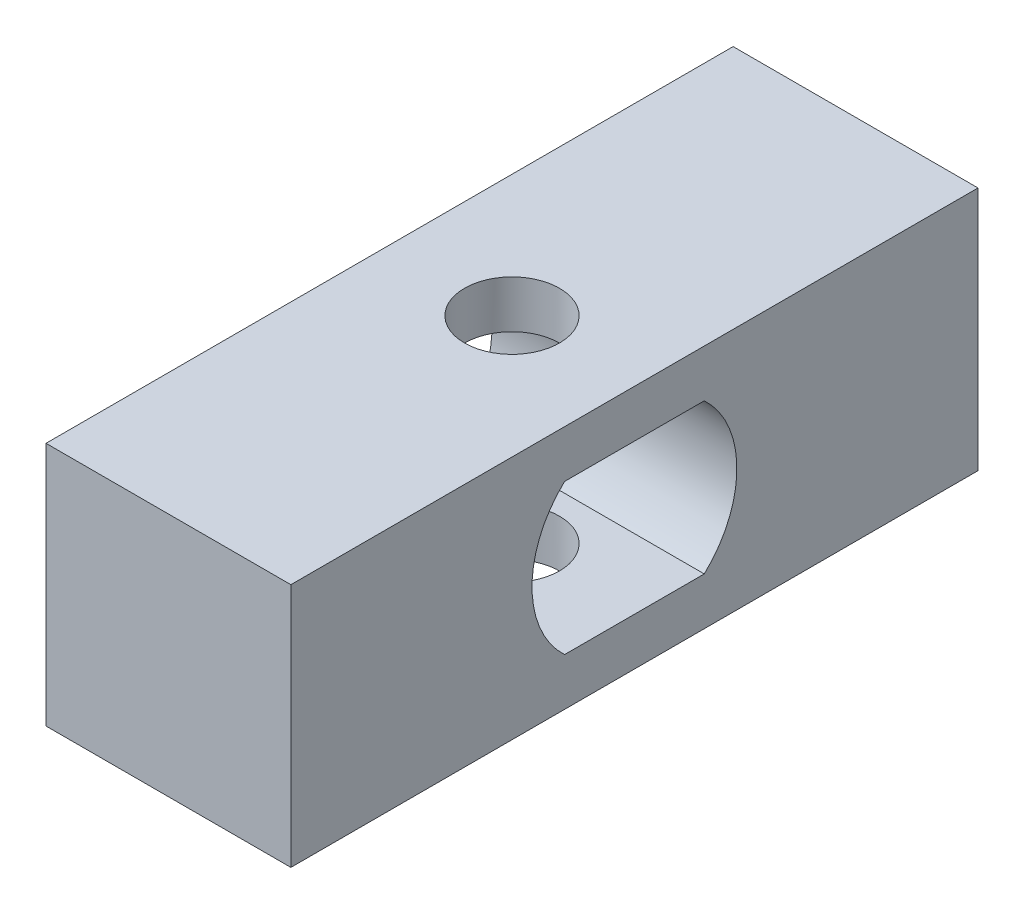
ISO-10303-21;
HEADER;
FILE_DESCRIPTION(('STEP AP214'),'2;1');
FILE_NAME('part.step','',(''),(''),'','','');
FILE_SCHEMA(('AUTOMOTIVE_DESIGN { 1 0 10303 214 1 1 1 1 }'));
ENDSEC;
DATA;
#1=APPLICATION_CONTEXT('core data for automotive mechanical design processes');
#2=APPLICATION_PROTOCOL_DEFINITION('international standard','automotive_design',2000,#1);
#3=PRODUCT_CONTEXT('',#1,'mechanical');
#4=PRODUCT('Part','Part','',(#3));
#5=PRODUCT_RELATED_PRODUCT_CATEGORY('part','',(#4));
#6=PRODUCT_DEFINITION_FORMATION('','',#4);
#7=PRODUCT_DEFINITION_CONTEXT('part definition',#1,'design');
#8=PRODUCT_DEFINITION('design','',#6,#7);
#9=PRODUCT_DEFINITION_SHAPE('','',#8);
#10=(LENGTH_UNIT() NAMED_UNIT(*) SI_UNIT(.MILLI.,.METRE.));
#11=(NAMED_UNIT(*) PLANE_ANGLE_UNIT() SI_UNIT($,.RADIAN.));
#12=(NAMED_UNIT(*) SI_UNIT($,.STERADIAN.) SOLID_ANGLE_UNIT());
#13=UNCERTAINTY_MEASURE_WITH_UNIT(LENGTH_MEASURE(1.E-05),#10,'distance_accuracy_value','');
#14=(GEOMETRIC_REPRESENTATION_CONTEXT(3) GLOBAL_UNCERTAINTY_ASSIGNED_CONTEXT((#13)) GLOBAL_UNIT_ASSIGNED_CONTEXT((#10,
#11,#12)) REPRESENTATION_CONTEXT('',''));
#15=CARTESIAN_POINT('',(0.,0.,0.));
#16=DIRECTION('',(0.,0.,1.));
#17=DIRECTION('',(1.,0.,0.));
#18=AXIS2_PLACEMENT_3D('',#15,#16,#17);
#19=CARTESIAN_POINT('',(6.223,-6.223,17.4625));
#20=DIRECTION('',(-1.,0.,0.));
#21=DIRECTION('',(0.,0.,1.));
#22=AXIS2_PLACEMENT_3D('',#19,#20,#21);
#23=PLANE('',#22);
#24=DIRECTION('',(0.,0.,-1.));
#25=VECTOR('',#24,1.);
#26=CARTESIAN_POINT('',(6.223,-3.81,0.));
#27=LINE('',#26,#25);
#28=CARTESIAN_POINT('',(6.223,-3.81,3.54918990757046));
#29=VERTEX_POINT('',#28);
#30=CARTESIAN_POINT('',(6.223,-3.81,-3.54918990757046));
#31=VERTEX_POINT('',#30);
#32=EDGE_CURVE('E132',#29,#31,#27,.T.);
#33=ORIENTED_EDGE('',*,*,#32,.F.);
#34=CARTESIAN_POINT('',(6.223,0.,0.));
#35=DIRECTION('',(1.,0.,0.));
#36=DIRECTION('',(0.,0.,-1.));
#37=AXIS2_PLACEMENT_3D('',#34,#35,#36);
#38=CIRCLE('',#37,5.207);
#39=CARTESIAN_POINT('',(6.223,3.81,3.54918990757046));
#40=VERTEX_POINT('',#39);
#41=EDGE_CURVE('E52',#40,#29,#38,.T.);
#42=ORIENTED_EDGE('',*,*,#41,.F.);
#43=DIRECTION('',(0.,0.,-1.));
#44=VECTOR('',#43,1.);
#45=CARTESIAN_POINT('',(6.223,3.81,0.));
#46=LINE('',#45,#44);
#47=CARTESIAN_POINT('',(6.223,3.81,-3.54918990757046));
#48=VERTEX_POINT('',#47);
#49=EDGE_CURVE('E120',#40,#48,#46,.T.);
#50=ORIENTED_EDGE('',*,*,#49,.T.);
#51=CARTESIAN_POINT('',(6.223,0.,0.));
#52=DIRECTION('',(1.,0.,0.));
#53=DIRECTION('',(0.,0.,-1.));
#54=AXIS2_PLACEMENT_3D('',#51,#52,#53);
#55=CIRCLE('',#54,5.207);
#56=EDGE_CURVE('E123',#31,#48,#55,.T.);
#57=ORIENTED_EDGE('',*,*,#56,.F.);
#58=EDGE_LOOP('',(#33,#42,#50,#57));
#59=FACE_BOUND('',#58,.T.);
#60=DIRECTION('',(0.,1.,0.));
#61=VECTOR('',#60,1.);
#62=CARTESIAN_POINT('',(6.223,-6.223,-17.4625));
#63=LINE('',#62,#61);
#64=CARTESIAN_POINT('',(6.223,-6.223,-17.4625));
#65=VERTEX_POINT('',#64);
#66=CARTESIAN_POINT('',(6.223,6.223,-17.4625));
#67=VERTEX_POINT('',#66);
#68=EDGE_CURVE('E138',#65,#67,#63,.T.);
#69=ORIENTED_EDGE('',*,*,#68,.T.);
#70=DIRECTION('',(0.,0.,-1.));
#71=VECTOR('',#70,1.);
#72=CARTESIAN_POINT('',(6.223,6.223,17.4625));
#73=LINE('',#72,#71);
#74=CARTESIAN_POINT('',(6.223,6.223,17.4625));
#75=VERTEX_POINT('',#74);
#76=EDGE_CURVE('E11',#75,#67,#73,.T.);
#77=ORIENTED_EDGE('',*,*,#76,.F.);
#78=DIRECTION('',(0.,1.,0.));
#79=VECTOR('',#78,1.);
#80=CARTESIAN_POINT('',(6.223,-6.223,17.4625));
#81=LINE('',#80,#79);
#82=CARTESIAN_POINT('',(6.223,-6.223,17.4625));
#83=VERTEX_POINT('',#82);
#84=EDGE_CURVE('E142',#83,#75,#81,.T.);
#85=ORIENTED_EDGE('',*,*,#84,.F.);
#86=DIRECTION('',(0.,0.,-1.));
#87=VECTOR('',#86,1.);
#88=CARTESIAN_POINT('',(6.223,-6.223,17.4625));
#89=LINE('',#88,#87);
#90=EDGE_CURVE('E152',#83,#65,#89,.T.);
#91=ORIENTED_EDGE('',*,*,#90,.T.);
#92=EDGE_LOOP('',(#69,#77,#85,#91));
#93=FACE_BOUND('',#92,.T.);
#94=ADVANCED_FACE('F37',(#59,#93),#23,.F.);
#95=CARTESIAN_POINT('',(-6.223,6.223,17.4625));
#96=DIRECTION('',(0.,-1.,0.));
#97=DIRECTION('',(0.,0.,-1.));
#98=AXIS2_PLACEMENT_3D('',#95,#96,#97);
#99=PLANE('',#98);
#100=CARTESIAN_POINT('',(0.,6.223,0.));
#101=DIRECTION('',(0.,1.,0.));
#102=DIRECTION('',(0.,0.,1.));
#103=AXIS2_PLACEMENT_3D('',#100,#101,#102);
#104=CIRCLE('',#103,2.413);
#105=CARTESIAN_POINT('',(0.,6.223,2.413));
#106=VERTEX_POINT('',#105);
#107=EDGE_CURVE('E226',#106,#106,#104,.T.);
#108=ORIENTED_EDGE('',*,*,#107,.F.);
#109=EDGE_LOOP('',(#108));
#110=FACE_BOUND('',#109,.T.);
#111=DIRECTION('',(-1.,0.,0.));
#112=VECTOR('',#111,1.);
#113=CARTESIAN_POINT('',(-6.223,6.223,-17.4625));
#114=LINE('',#113,#112);
#115=CARTESIAN_POINT('',(-6.223,6.223,-17.4625));
#116=VERTEX_POINT('',#115);
#117=EDGE_CURVE('E155',#67,#116,#114,.T.);
#118=ORIENTED_EDGE('',*,*,#117,.T.);
#119=DIRECTION('',(0.,0.,-1.));
#120=VECTOR('',#119,1.);
#121=CARTESIAN_POINT('',(-6.223,6.223,17.4625));
#122=LINE('',#121,#120);
#123=CARTESIAN_POINT('',(-6.223,6.223,17.4625));
#124=VERTEX_POINT('',#123);
#125=EDGE_CURVE('E45',#124,#116,#122,.T.);
#126=ORIENTED_EDGE('',*,*,#125,.F.);
#127=DIRECTION('',(-1.,0.,0.));
#128=VECTOR('',#127,1.);
#129=CARTESIAN_POINT('',(-6.223,6.223,17.4625));
#130=LINE('',#129,#128);
#131=EDGE_CURVE('E145',#75,#124,#130,.T.);
#132=ORIENTED_EDGE('',*,*,#131,.F.);
#133=ORIENTED_EDGE('',*,*,#76,.T.);
#134=EDGE_LOOP('',(#118,#126,#132,#133));
#135=FACE_BOUND('',#134,.T.);
#136=ADVANCED_FACE('F184',(#110,#135),#99,.F.);
#137=CARTESIAN_POINT('',(-6.223,-6.223,17.4625));
#138=DIRECTION('',(1.,0.,0.));
#139=DIRECTION('',(0.,0.,-1.));
#140=AXIS2_PLACEMENT_3D('',#137,#138,#139);
#141=PLANE('',#140);
#142=DIRECTION('',(0.,0.,-1.));
#143=VECTOR('',#142,1.);
#144=CARTESIAN_POINT('',(-6.223,3.81,0.));
#145=LINE('',#144,#143);
#146=CARTESIAN_POINT('',(-6.223,3.81,3.54918990757046));
#147=VERTEX_POINT('',#146);
#148=CARTESIAN_POINT('',(-6.223,3.81,-3.54918990757046));
#149=VERTEX_POINT('',#148);
#150=EDGE_CURVE('E111',#147,#149,#145,.T.);
#151=ORIENTED_EDGE('',*,*,#150,.F.);
#152=CARTESIAN_POINT('',(-6.223,0.,0.));
#153=DIRECTION('',(1.,0.,0.));
#154=DIRECTION('',(0.,0.,-1.));
#155=AXIS2_PLACEMENT_3D('',#152,#153,#154);
#156=CIRCLE('',#155,5.207);
#157=CARTESIAN_POINT('',(-6.223,-3.81,3.54918990757046));
#158=VERTEX_POINT('',#157);
#159=EDGE_CURVE('E105',#147,#158,#156,.T.);
#160=ORIENTED_EDGE('',*,*,#159,.T.);
#161=DIRECTION('',(0.,0.,-1.));
#162=VECTOR('',#161,1.);
#163=CARTESIAN_POINT('',(-6.223,-3.81,0.));
#164=LINE('',#163,#162);
#165=CARTESIAN_POINT('',(-6.223,-3.81,-3.54918990757046));
#166=VERTEX_POINT('',#165);
#167=EDGE_CURVE('E114',#158,#166,#164,.T.);
#168=ORIENTED_EDGE('',*,*,#167,.T.);
#169=CARTESIAN_POINT('',(-6.223,0.,0.));
#170=DIRECTION('',(1.,0.,0.));
#171=DIRECTION('',(0.,0.,-1.));
#172=AXIS2_PLACEMENT_3D('',#169,#170,#171);
#173=CIRCLE('',#172,5.207);
#174=EDGE_CURVE('E60',#166,#149,#173,.T.);
#175=ORIENTED_EDGE('',*,*,#174,.T.);
#176=EDGE_LOOP('',(#151,#160,#168,#175));
#177=FACE_BOUND('',#176,.T.);
#178=DIRECTION('',(0.,-1.,0.));
#179=VECTOR('',#178,1.);
#180=CARTESIAN_POINT('',(-6.223,-6.223,-17.4625));
#181=LINE('',#180,#179);
#182=CARTESIAN_POINT('',(-6.223,-6.223,-17.4625));
#183=VERTEX_POINT('',#182);
#184=EDGE_CURVE('E157',#116,#183,#181,.T.);
#185=ORIENTED_EDGE('',*,*,#184,.T.);
#186=DIRECTION('',(0.,0.,-1.));
#187=VECTOR('',#186,1.);
#188=CARTESIAN_POINT('',(-6.223,-6.223,17.4625));
#189=LINE('',#188,#187);
#190=CARTESIAN_POINT('',(-6.223,-6.223,17.4625));
#191=VERTEX_POINT('',#190);
#192=EDGE_CURVE('E162',#191,#183,#189,.T.);
#193=ORIENTED_EDGE('',*,*,#192,.F.);
#194=DIRECTION('',(0.,-1.,0.));
#195=VECTOR('',#194,1.);
#196=CARTESIAN_POINT('',(-6.223,-6.223,17.4625));
#197=LINE('',#196,#195);
#198=EDGE_CURVE('E148',#124,#191,#197,.T.);
#199=ORIENTED_EDGE('',*,*,#198,.F.);
#200=ORIENTED_EDGE('',*,*,#125,.T.);
#201=EDGE_LOOP('',(#185,#193,#199,#200));
#202=FACE_BOUND('',#201,.T.);
#203=ADVANCED_FACE('F118',(#177,#202),#141,.F.);
#204=CARTESIAN_POINT('',(-6.223,-6.223,17.4625));
#205=DIRECTION('',(0.,1.,0.));
#206=DIRECTION('',(0.,0.,1.));
#207=AXIS2_PLACEMENT_3D('',#204,#205,#206);
#208=PLANE('',#207);
#209=CARTESIAN_POINT('',(0.,-6.223,0.));
#210=DIRECTION('',(0.,1.,0.));
#211=DIRECTION('',(0.,0.,1.));
#212=AXIS2_PLACEMENT_3D('',#209,#210,#211);
#213=CIRCLE('',#212,2.413);
#214=CARTESIAN_POINT('',(0.,-6.223,2.413));
#215=VERTEX_POINT('',#214);
#216=EDGE_CURVE('E227',#215,#215,#213,.T.);
#217=ORIENTED_EDGE('',*,*,#216,.T.);
#218=EDGE_LOOP('',(#217));
#219=FACE_BOUND('',#218,.T.);
#220=DIRECTION('',(1.,0.,0.));
#221=VECTOR('',#220,1.);
#222=CARTESIAN_POINT('',(-6.223,-6.223,-17.4625));
#223=LINE('',#222,#221);
#224=EDGE_CURVE('E146',#183,#65,#223,.T.);
#225=ORIENTED_EDGE('',*,*,#224,.T.);
#226=ORIENTED_EDGE('',*,*,#90,.F.);
#227=DIRECTION('',(1.,0.,0.));
#228=VECTOR('',#227,1.);
#229=CARTESIAN_POINT('',(-6.223,-6.223,17.4625));
#230=LINE('',#229,#228);
#231=EDGE_CURVE('E150',#191,#83,#230,.T.);
#232=ORIENTED_EDGE('',*,*,#231,.F.);
#233=ORIENTED_EDGE('',*,*,#192,.T.);
#234=EDGE_LOOP('',(#225,#226,#232,#233));
#235=FACE_BOUND('',#234,.T.);
#236=ADVANCED_FACE('F177',(#219,#235),#208,.F.);
#237=CARTESIAN_POINT('',(0.,0.,17.4625));
#238=DIRECTION('',(0.,0.,-1.));
#239=DIRECTION('',(-1.,0.,0.));
#240=AXIS2_PLACEMENT_3D('',#237,#238,#239);
#241=PLANE('',#240);
#242=ORIENTED_EDGE('',*,*,#84,.T.);
#243=ORIENTED_EDGE('',*,*,#131,.T.);
#244=ORIENTED_EDGE('',*,*,#198,.T.);
#245=ORIENTED_EDGE('',*,*,#231,.T.);
#246=EDGE_LOOP('',(#242,#243,#244,#245));
#247=FACE_BOUND('',#246,.T.);
#248=ADVANCED_FACE('F183',(#247),#241,.F.);
#249=CARTESIAN_POINT('',(0.,0.,-17.4625));
#250=DIRECTION('',(0.,0.,-1.));
#251=DIRECTION('',(-1.,0.,0.));
#252=AXIS2_PLACEMENT_3D('',#249,#250,#251);
#253=PLANE('',#252);
#254=ORIENTED_EDGE('',*,*,#68,.F.);
#255=ORIENTED_EDGE('',*,*,#224,.F.);
#256=ORIENTED_EDGE('',*,*,#184,.F.);
#257=ORIENTED_EDGE('',*,*,#117,.F.);
#258=EDGE_LOOP('',(#254,#255,#256,#257));
#259=FACE_BOUND('',#258,.T.);
#260=ADVANCED_FACE('F174',(#259),#253,.T.);
#261=CARTESIAN_POINT('',(-6.223,0.,0.));
#262=DIRECTION('',(1.,0.,0.));
#263=DIRECTION('',(0.,0.,-1.));
#264=AXIS2_PLACEMENT_3D('',#261,#262,#263);
#265=CYLINDRICAL_SURFACE('',#264,5.207);
#266=ORIENTED_EDGE('',*,*,#41,.T.);
#267=DIRECTION('',(1.,0.,0.));
#268=VECTOR('',#267,1.);
#269=CARTESIAN_POINT('',(-6.223,-3.81,3.54918990757046));
#270=LINE('',#269,#268);
#271=EDGE_CURVE('E101',#158,#29,#270,.T.);
#272=ORIENTED_EDGE('',*,*,#271,.F.);
#273=ORIENTED_EDGE('',*,*,#159,.F.);
#274=DIRECTION('',(1.,0.,0.));
#275=VECTOR('',#274,1.);
#276=CARTESIAN_POINT('',(-6.223,3.81,3.54918990757046));
#277=LINE('',#276,#275);
#278=EDGE_CURVE('E136',#147,#40,#277,.T.);
#279=ORIENTED_EDGE('',*,*,#278,.T.);
#280=EDGE_LOOP('',(#266,#272,#273,#279));
#281=FACE_BOUND('',#280,.T.);
#282=ADVANCED_FACE('F103',(#281),#265,.F.);
#283=CARTESIAN_POINT('',(-6.223,3.81,0.));
#284=DIRECTION('',(0.,-1.,0.));
#285=DIRECTION('',(0.,0.,-1.));
#286=AXIS2_PLACEMENT_3D('',#283,#284,#285);
#287=PLANE('',#286);
#288=CARTESIAN_POINT('',(0.,3.81,0.));
#289=DIRECTION('',(0.,-1.,0.));
#290=DIRECTION('',(0.,0.,-1.));
#291=AXIS2_PLACEMENT_3D('',#288,#289,#290);
#292=CIRCLE('',#291,2.413);
#293=CARTESIAN_POINT('',(0.,3.81,-2.413));
#294=VERTEX_POINT('',#293);
#295=EDGE_CURVE('E126',#294,#294,#292,.T.);
#296=ORIENTED_EDGE('',*,*,#295,.F.);
#297=EDGE_LOOP('',(#296));
#298=FACE_BOUND('',#297,.T.);
#299=ORIENTED_EDGE('',*,*,#49,.F.);
#300=ORIENTED_EDGE('',*,*,#278,.F.);
#301=ORIENTED_EDGE('',*,*,#150,.T.);
#302=DIRECTION('',(1.,0.,0.));
#303=VECTOR('',#302,1.);
#304=CARTESIAN_POINT('',(-6.223,3.81,-3.54918990757046));
#305=LINE('',#304,#303);
#306=EDGE_CURVE('E139',#149,#48,#305,.T.);
#307=ORIENTED_EDGE('',*,*,#306,.T.);
#308=EDGE_LOOP('',(#299,#300,#301,#307));
#309=FACE_BOUND('',#308,.T.);
#310=ADVANCED_FACE('F204',(#298,#309),#287,.T.);
#311=CARTESIAN_POINT('',(-6.223,0.,0.));
#312=DIRECTION('',(1.,0.,0.));
#313=DIRECTION('',(0.,0.,-1.));
#314=AXIS2_PLACEMENT_3D('',#311,#312,#313);
#315=CYLINDRICAL_SURFACE('',#314,5.207);
#316=ORIENTED_EDGE('',*,*,#56,.T.);
#317=ORIENTED_EDGE('',*,*,#306,.F.);
#318=ORIENTED_EDGE('',*,*,#174,.F.);
#319=DIRECTION('',(1.,0.,0.));
#320=VECTOR('',#319,1.);
#321=CARTESIAN_POINT('',(-6.223,-3.81,-3.54918990757046));
#322=LINE('',#321,#320);
#323=EDGE_CURVE('E110',#166,#31,#322,.T.);
#324=ORIENTED_EDGE('',*,*,#323,.T.);
#325=EDGE_LOOP('',(#316,#317,#318,#324));
#326=FACE_BOUND('',#325,.T.);
#327=ADVANCED_FACE('F208',(#326),#315,.F.);
#328=CARTESIAN_POINT('',(-6.223,-3.81,0.));
#329=DIRECTION('',(0.,-1.,0.));
#330=DIRECTION('',(0.,0.,-1.));
#331=AXIS2_PLACEMENT_3D('',#328,#329,#330);
#332=PLANE('',#331);
#333=CARTESIAN_POINT('',(0.,-3.81,0.));
#334=DIRECTION('',(0.,-1.,0.));
#335=DIRECTION('',(0.,0.,-1.));
#336=AXIS2_PLACEMENT_3D('',#333,#334,#335);
#337=CIRCLE('',#336,2.413);
#338=CARTESIAN_POINT('',(0.,-3.81,-2.413));
#339=VERTEX_POINT('',#338);
#340=EDGE_CURVE('E40',#339,#339,#337,.T.);
#341=ORIENTED_EDGE('',*,*,#340,.T.);
#342=EDGE_LOOP('',(#341));
#343=FACE_BOUND('',#342,.T.);
#344=ORIENTED_EDGE('',*,*,#32,.T.);
#345=ORIENTED_EDGE('',*,*,#323,.F.);
#346=ORIENTED_EDGE('',*,*,#167,.F.);
#347=ORIENTED_EDGE('',*,*,#271,.T.);
#348=EDGE_LOOP('',(#344,#345,#346,#347));
#349=FACE_BOUND('',#348,.T.);
#350=ADVANCED_FACE('F115',(#343,#349),#332,.F.);
#351=CARTESIAN_POINT('',(0.,-6.223,0.));
#352=DIRECTION('',(0.,1.,0.));
#353=DIRECTION('',(0.,0.,1.));
#354=AXIS2_PLACEMENT_3D('',#351,#352,#353);
#355=CYLINDRICAL_SURFACE('',#354,2.413);
#356=ORIENTED_EDGE('',*,*,#216,.F.);
#357=EDGE_LOOP('',(#356));
#358=FACE_BOUND('',#357,.T.);
#359=ORIENTED_EDGE('',*,*,#340,.F.);
#360=EDGE_LOOP('',(#359));
#361=FACE_BOUND('',#360,.T.);
#362=ADVANCED_FACE('F207',(#358,#361),#355,.F.);
#363=ORIENTED_EDGE('',*,*,#295,.T.);
#364=EDGE_LOOP('',(#363));
#365=FACE_BOUND('',#364,.T.);
#366=ORIENTED_EDGE('',*,*,#107,.T.);
#367=EDGE_LOOP('',(#366));
#368=FACE_BOUND('',#367,.T.);
#369=ADVANCED_FACE('F215',(#365,#368),#355,.F.);
#370=CLOSED_SHELL('',(#94,#136,#203,#236,#248,#260,#282,#310,#327,#350,#362,#369));
#371=MANIFOLD_SOLID_BREP('B2',#370);
#372=ADVANCED_BREP_SHAPE_REPRESENTATION('',(#18,#371),#14);
#373=SHAPE_DEFINITION_REPRESENTATION(#9,#372);
ENDSEC;
END-ISO-10303-21;
